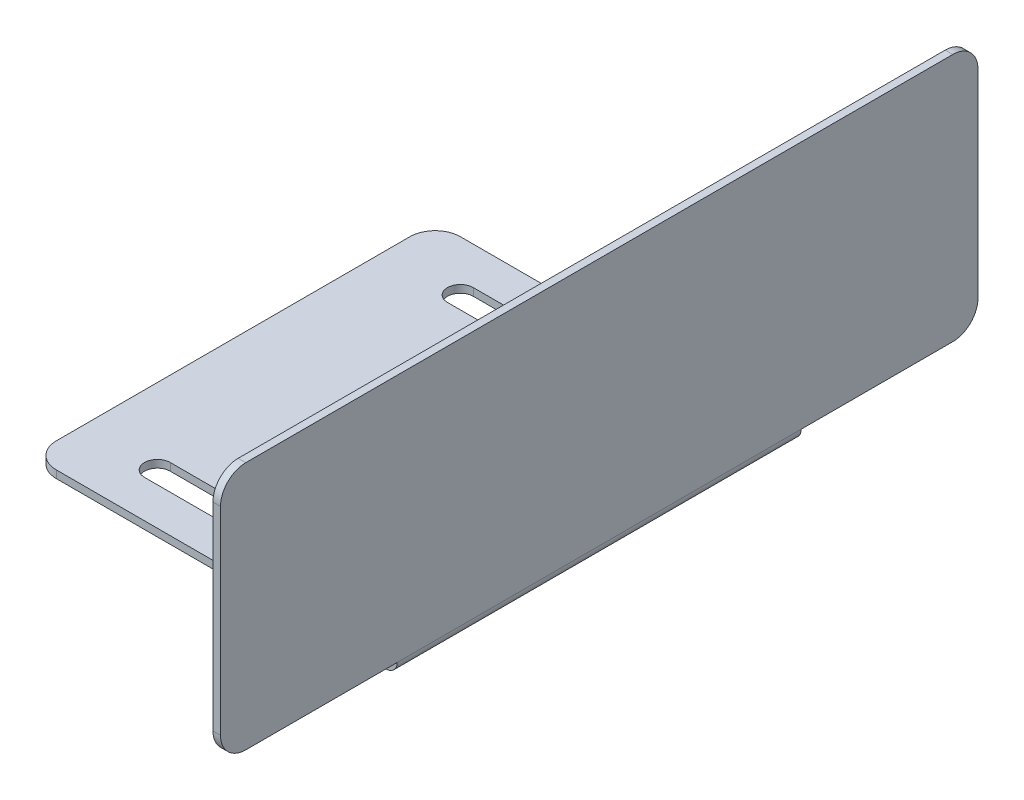
ISO-10303-21;
HEADER;
FILE_DESCRIPTION(('STEP AP214'),'2;1');
FILE_NAME('part.step','',(''),(''),'','','');
FILE_SCHEMA(('AUTOMOTIVE_DESIGN { 1 0 10303 214 1 1 1 1 }'));
ENDSEC;
DATA;
#1=APPLICATION_CONTEXT('core data for automotive mechanical design processes');
#2=APPLICATION_PROTOCOL_DEFINITION('international standard','automotive_design',2000,#1);
#3=PRODUCT_CONTEXT('',#1,'mechanical');
#4=PRODUCT('Part','Part','',(#3));
#5=PRODUCT_RELATED_PRODUCT_CATEGORY('part','',(#4));
#6=PRODUCT_DEFINITION_FORMATION('','',#4);
#7=PRODUCT_DEFINITION_CONTEXT('part definition',#1,'design');
#8=PRODUCT_DEFINITION('design','',#6,#7);
#9=PRODUCT_DEFINITION_SHAPE('','',#8);
#10=(LENGTH_UNIT() NAMED_UNIT(*) SI_UNIT(.MILLI.,.METRE.));
#11=(NAMED_UNIT(*) PLANE_ANGLE_UNIT() SI_UNIT($,.RADIAN.));
#12=(NAMED_UNIT(*) SI_UNIT($,.STERADIAN.) SOLID_ANGLE_UNIT());
#13=UNCERTAINTY_MEASURE_WITH_UNIT(LENGTH_MEASURE(1.E-05),#10,'distance_accuracy_value','');
#14=(GEOMETRIC_REPRESENTATION_CONTEXT(3) GLOBAL_UNCERTAINTY_ASSIGNED_CONTEXT((#13)) GLOBAL_UNIT_ASSIGNED_CONTEXT((#10,
#11,#12)) REPRESENTATION_CONTEXT('',''));
#15=CARTESIAN_POINT('',(0.,0.,0.));
#16=DIRECTION('',(0.,0.,1.));
#17=DIRECTION('',(1.,0.,0.));
#18=AXIS2_PLACEMENT_3D('',#15,#16,#17);
#19=CARTESIAN_POINT('',(37.,-26.5,35.));
#20=DIRECTION('',(0.,0.,1.));
#21=DIRECTION('',(1.,0.,0.));
#22=AXIS2_PLACEMENT_3D('',#19,#20,#21);
#23=PLANE('',#22);
#24=DIRECTION('',(-1.,0.,0.));
#25=VECTOR('',#24,1.);
#26=CARTESIAN_POINT('',(37.,-26.5,35.));
#27=LINE('',#26,#25);
#28=CARTESIAN_POINT('',(34.7634,-26.5,35.));
#29=VERTEX_POINT('',#28);
#30=CARTESIAN_POINT('',(-30.5,-26.5,35.));
#31=VERTEX_POINT('',#30);
#32=EDGE_CURVE('E214',#29,#31,#27,.T.);
#33=ORIENTED_EDGE('',*,*,#32,.T.);
#34=DIRECTION('',(0.,1.,0.));
#35=VECTOR('',#34,1.);
#36=CARTESIAN_POINT('',(-30.5,-25.,35.));
#37=LINE('',#36,#35);
#38=CARTESIAN_POINT('',(-30.5,-25.,35.));
#39=VERTEX_POINT('',#38);
#40=EDGE_CURVE('E287',#31,#39,#37,.T.);
#41=ORIENTED_EDGE('',*,*,#40,.T.);
#42=DIRECTION('',(1.,0.,0.));
#43=VECTOR('',#42,1.);
#44=CARTESIAN_POINT('',(-35.5,-25.,35.));
#45=LINE('',#44,#43);
#46=CARTESIAN_POINT('',(34.7634,-25.,35.));
#47=VERTEX_POINT('',#46);
#48=EDGE_CURVE('E480',#39,#47,#45,.T.);
#49=ORIENTED_EDGE('',*,*,#48,.T.);
#50=DIRECTION('',(0.,-1.,0.));
#51=VECTOR('',#50,1.);
#52=CARTESIAN_POINT('',(34.7634,-25.,35.));
#53=LINE('',#52,#51);
#54=EDGE_CURVE('E284',#47,#29,#53,.T.);
#55=ORIENTED_EDGE('',*,*,#54,.T.);
#56=EDGE_LOOP('',(#33,#41,#49,#55));
#57=FACE_BOUND('',#56,.T.);
#58=ADVANCED_FACE('F41',(#57),#23,.F.);
#59=CARTESIAN_POINT('',(37.,-26.5,115.));
#60=DIRECTION('',(0.,0.,-1.));
#61=DIRECTION('',(-1.,0.,0.));
#62=AXIS2_PLACEMENT_3D('',#59,#60,#61);
#63=PLANE('',#62);
#64=DIRECTION('',(-1.,0.,0.));
#65=VECTOR('',#64,1.);
#66=CARTESIAN_POINT('',(-35.5,-25.,115.));
#67=LINE('',#66,#65);
#68=CARTESIAN_POINT('',(34.7634,-25.,115.));
#69=VERTEX_POINT('',#68);
#70=CARTESIAN_POINT('',(-30.5,-25.,115.));
#71=VERTEX_POINT('',#70);
#72=EDGE_CURVE('E460',#69,#71,#67,.T.);
#73=ORIENTED_EDGE('',*,*,#72,.T.);
#74=DIRECTION('',(0.,-1.,0.));
#75=VECTOR('',#74,1.);
#76=CARTESIAN_POINT('',(-30.5,-26.5,115.));
#77=LINE('',#76,#75);
#78=CARTESIAN_POINT('',(-30.5,-26.5,115.));
#79=VERTEX_POINT('',#78);
#80=EDGE_CURVE('E309',#71,#79,#77,.T.);
#81=ORIENTED_EDGE('',*,*,#80,.T.);
#82=DIRECTION('',(-1.,0.,0.));
#83=VECTOR('',#82,1.);
#84=CARTESIAN_POINT('',(37.,-26.5,115.));
#85=LINE('',#84,#83);
#86=CARTESIAN_POINT('',(34.7634,-26.5,115.));
#87=VERTEX_POINT('',#86);
#88=EDGE_CURVE('E475',#87,#79,#85,.T.);
#89=ORIENTED_EDGE('',*,*,#88,.F.);
#90=DIRECTION('',(0.,1.,0.));
#91=VECTOR('',#90,1.);
#92=CARTESIAN_POINT('',(34.7634,-26.5,115.));
#93=LINE('',#92,#91);
#94=EDGE_CURVE('E234',#87,#69,#93,.T.);
#95=ORIENTED_EDGE('',*,*,#94,.T.);
#96=EDGE_LOOP('',(#73,#81,#89,#95));
#97=FACE_BOUND('',#96,.T.);
#98=ADVANCED_FACE('F516',(#97),#63,.F.);
#99=CARTESIAN_POINT('',(-35.5,-25.,150.));
#100=DIRECTION('',(0.,1.,0.));
#101=DIRECTION('',(0.,0.,1.));
#102=AXIS2_PLACEMENT_3D('',#99,#100,#101);
#103=PLANE('',#102);
#104=ORIENTED_EDGE('',*,*,#48,.F.);
#105=CARTESIAN_POINT('',(-30.5,-25.,40.));
#106=DIRECTION('',(0.,1.,0.));
#107=DIRECTION('',(0.,0.,1.));
#108=AXIS2_PLACEMENT_3D('',#105,#106,#107);
#109=CIRCLE('',#108,5.);
#110=CARTESIAN_POINT('',(-35.5,-25.,40.));
#111=VERTEX_POINT('',#110);
#112=EDGE_CURVE('E294',#39,#111,#109,.T.);
#113=ORIENTED_EDGE('',*,*,#112,.T.);
#114=DIRECTION('',(0.,0.,-1.));
#115=VECTOR('',#114,1.);
#116=CARTESIAN_POINT('',(-35.5,-25.,150.));
#117=LINE('',#116,#115);
#118=CARTESIAN_POINT('',(-35.5,-25.,110.));
#119=VERTEX_POINT('',#118);
#120=EDGE_CURVE('E260',#119,#111,#117,.T.);
#121=ORIENTED_EDGE('',*,*,#120,.F.);
#122=CARTESIAN_POINT('',(-30.5,-25.,110.));
#123=DIRECTION('',(0.,1.,0.));
#124=DIRECTION('',(0.,0.,1.));
#125=AXIS2_PLACEMENT_3D('',#122,#123,#124);
#126=CIRCLE('',#125,5.);
#127=EDGE_CURVE('E291',#119,#71,#126,.T.);
#128=ORIENTED_EDGE('',*,*,#127,.T.);
#129=ORIENTED_EDGE('',*,*,#72,.F.);
#130=DIRECTION('',(0.,0.,-1.));
#131=VECTOR('',#130,1.);
#132=CARTESIAN_POINT('',(34.7634,-25.,150.));
#133=LINE('',#132,#131);
#134=EDGE_CURVE('E264',#69,#47,#133,.T.);
#135=ORIENTED_EDGE('',*,*,#134,.T.);
#136=EDGE_LOOP('',(#104,#113,#121,#128,#129,#135));
#137=FACE_BOUND('',#136,.T.);
#138=DIRECTION('',(1.,0.,0.));
#139=VECTOR('',#138,1.);
#140=CARTESIAN_POINT('',(0.,-25.,47.5500000000001));
#141=LINE('',#140,#139);
#142=CARTESIAN_POINT('',(-20.4999999999999,-25.,47.5500000000001));
#143=VERTEX_POINT('',#142);
#144=CARTESIAN_POINT('',(-5.49999999999992,-25.,47.5500000000001));
#145=VERTEX_POINT('',#144);
#146=EDGE_CURVE('E406',#143,#145,#141,.T.);
#147=ORIENTED_EDGE('',*,*,#146,.F.);
#148=CARTESIAN_POINT('',(-20.4999999999996,-25.,45.));
#149=DIRECTION('',(0.,1.,0.));
#150=DIRECTION('',(0.,0.,1.));
#151=AXIS2_PLACEMENT_3D('',#148,#149,#150);
#152=CIRCLE('',#151,2.54999999999998);
#153=CARTESIAN_POINT('',(-20.5,-25.,42.4500000000001));
#154=VERTEX_POINT('',#153);
#155=EDGE_CURVE('E410',#143,#154,#152,.F.);
#156=ORIENTED_EDGE('',*,*,#155,.T.);
#157=DIRECTION('',(1.,0.,0.));
#158=VECTOR('',#157,1.);
#159=CARTESIAN_POINT('',(0.,-25.,42.4500000000001));
#160=LINE('',#159,#158);
#161=CARTESIAN_POINT('',(-5.49999999999985,-25.,42.4500000000001));
#162=VERTEX_POINT('',#161);
#163=EDGE_CURVE('E397',#154,#162,#160,.T.);
#164=ORIENTED_EDGE('',*,*,#163,.T.);
#165=CARTESIAN_POINT('',(-5.50000000000026,-25.,45.));
#166=DIRECTION('',(0.,1.,0.));
#167=DIRECTION('',(0.,0.,1.));
#168=AXIS2_PLACEMENT_3D('',#165,#166,#167);
#169=CIRCLE('',#168,2.54999999999998);
#170=EDGE_CURVE('E402',#145,#162,#169,.T.);
#171=ORIENTED_EDGE('',*,*,#170,.F.);
#172=EDGE_LOOP('',(#147,#156,#164,#171));
#173=FACE_BOUND('',#172,.T.);
#174=DIRECTION('',(1.,0.,0.));
#175=VECTOR('',#174,1.);
#176=CARTESIAN_POINT('',(0.,-25.,102.45));
#177=LINE('',#176,#175);
#178=CARTESIAN_POINT('',(-20.4999999999999,-25.,102.45));
#179=VERTEX_POINT('',#178);
#180=CARTESIAN_POINT('',(-5.49999999999992,-25.,102.45));
#181=VERTEX_POINT('',#180);
#182=EDGE_CURVE('E445',#179,#181,#177,.T.);
#183=ORIENTED_EDGE('',*,*,#182,.T.);
#184=CARTESIAN_POINT('',(-5.49999999999992,-25.,105.));
#185=DIRECTION('',(0.,1.,0.));
#186=DIRECTION('',(0.,0.,1.));
#187=AXIS2_PLACEMENT_3D('',#184,#185,#186);
#188=CIRCLE('',#187,2.54999999999998);
#189=CARTESIAN_POINT('',(-5.49999999999985,-25.,107.55));
#190=VERTEX_POINT('',#189);
#191=EDGE_CURVE('E414',#181,#190,#188,.F.);
#192=ORIENTED_EDGE('',*,*,#191,.T.);
#193=DIRECTION('',(1.,0.,0.));
#194=VECTOR('',#193,1.);
#195=CARTESIAN_POINT('',(0.,-25.,107.55));
#196=LINE('',#195,#194);
#197=CARTESIAN_POINT('',(-20.5,-25.,107.55));
#198=VERTEX_POINT('',#197);
#199=EDGE_CURVE('E429',#198,#190,#196,.T.);
#200=ORIENTED_EDGE('',*,*,#199,.F.);
#201=CARTESIAN_POINT('',(-20.5,-25.,105.));
#202=DIRECTION('',(0.,1.,0.));
#203=DIRECTION('',(0.,0.,1.));
#204=AXIS2_PLACEMENT_3D('',#201,#202,#203);
#205=CIRCLE('',#204,2.54999999999998);
#206=EDGE_CURVE('E449',#179,#198,#205,.T.);
#207=ORIENTED_EDGE('',*,*,#206,.F.);
#208=EDGE_LOOP('',(#183,#192,#200,#207));
#209=FACE_BOUND('',#208,.T.);
#210=ADVANCED_FACE('F503',(#137,#173,#209),#103,.T.);
#211=CARTESIAN_POINT('',(-35.5,-26.5,150.));
#212=DIRECTION('',(0.,1.,0.));
#213=DIRECTION('',(0.,0.,1.));
#214=AXIS2_PLACEMENT_3D('',#211,#212,#213);
#215=PLANE('',#214);
#216=CARTESIAN_POINT('',(-20.4999999999996,-26.5,45.));
#217=DIRECTION('',(0.,1.,0.));
#218=DIRECTION('',(0.,0.,1.));
#219=AXIS2_PLACEMENT_3D('',#216,#217,#218);
#220=CIRCLE('',#219,2.54999999999998);
#221=CARTESIAN_POINT('',(-20.4999999999999,-26.5,47.5500000000001));
#222=VERTEX_POINT('',#221);
#223=CARTESIAN_POINT('',(-20.5,-26.5,42.4500000000001));
#224=VERTEX_POINT('',#223);
#225=EDGE_CURVE('E401',#222,#224,#220,.F.);
#226=ORIENTED_EDGE('',*,*,#225,.F.);
#227=DIRECTION('',(1.,0.,0.));
#228=VECTOR('',#227,1.);
#229=CARTESIAN_POINT('',(0.,-26.5,47.5500000000001));
#230=LINE('',#229,#228);
#231=CARTESIAN_POINT('',(-5.49999999999992,-26.5,47.5500000000001));
#232=VERTEX_POINT('',#231);
#233=EDGE_CURVE('E420',#222,#232,#230,.T.);
#234=ORIENTED_EDGE('',*,*,#233,.T.);
#235=CARTESIAN_POINT('',(-5.50000000000026,-26.5,45.));
#236=DIRECTION('',(0.,1.,0.));
#237=DIRECTION('',(0.,0.,1.));
#238=AXIS2_PLACEMENT_3D('',#235,#236,#237);
#239=CIRCLE('',#238,2.54999999999998);
#240=CARTESIAN_POINT('',(-5.49999999999985,-26.5,42.4500000000001));
#241=VERTEX_POINT('',#240);
#242=EDGE_CURVE('E416',#232,#241,#239,.T.);
#243=ORIENTED_EDGE('',*,*,#242,.T.);
#244=DIRECTION('',(1.,0.,0.));
#245=VECTOR('',#244,1.);
#246=CARTESIAN_POINT('',(0.,-26.5,42.4500000000001));
#247=LINE('',#246,#245);
#248=EDGE_CURVE('E392',#224,#241,#247,.T.);
#249=ORIENTED_EDGE('',*,*,#248,.F.);
#250=EDGE_LOOP('',(#226,#234,#243,#249));
#251=FACE_BOUND('',#250,.T.);
#252=DIRECTION('',(0.,0.,-1.));
#253=VECTOR('',#252,1.);
#254=CARTESIAN_POINT('',(-35.5,-26.5,150.));
#255=LINE('',#254,#253);
#256=CARTESIAN_POINT('',(-35.5,-26.5,110.));
#257=VERTEX_POINT('',#256);
#258=CARTESIAN_POINT('',(-35.5,-26.5,40.));
#259=VERTEX_POINT('',#258);
#260=EDGE_CURVE('E256',#257,#259,#255,.T.);
#261=ORIENTED_EDGE('',*,*,#260,.T.);
#262=CARTESIAN_POINT('',(-30.5,-26.5,40.));
#263=DIRECTION('',(0.,1.,0.));
#264=DIRECTION('',(0.,0.,1.));
#265=AXIS2_PLACEMENT_3D('',#262,#263,#264);
#266=CIRCLE('',#265,5.);
#267=EDGE_CURVE('E306',#259,#31,#266,.F.);
#268=ORIENTED_EDGE('',*,*,#267,.T.);
#269=ORIENTED_EDGE('',*,*,#32,.F.);
#270=DIRECTION('',(0.,0.,-1.));
#271=VECTOR('',#270,1.);
#272=CARTESIAN_POINT('',(34.7634,-26.5,150.));
#273=LINE('',#272,#271);
#274=EDGE_CURVE('E232',#87,#29,#273,.T.);
#275=ORIENTED_EDGE('',*,*,#274,.F.);
#276=ORIENTED_EDGE('',*,*,#88,.T.);
#277=CARTESIAN_POINT('',(-30.5,-26.5,110.));
#278=DIRECTION('',(0.,1.,0.));
#279=DIRECTION('',(0.,0.,1.));
#280=AXIS2_PLACEMENT_3D('',#277,#278,#279);
#281=CIRCLE('',#280,5.);
#282=EDGE_CURVE('E303',#79,#257,#281,.F.);
#283=ORIENTED_EDGE('',*,*,#282,.T.);
#284=EDGE_LOOP('',(#261,#268,#269,#275,#276,#283));
#285=FACE_BOUND('',#284,.T.);
#286=CARTESIAN_POINT('',(-5.49999999999992,-26.5,105.));
#287=DIRECTION('',(0.,1.,0.));
#288=DIRECTION('',(0.,0.,1.));
#289=AXIS2_PLACEMENT_3D('',#286,#287,#288);
#290=CIRCLE('',#289,2.54999999999998);
#291=CARTESIAN_POINT('',(-5.49999999999992,-26.5,102.45));
#292=VERTEX_POINT('',#291);
#293=CARTESIAN_POINT('',(-5.49999999999985,-26.5,107.55));
#294=VERTEX_POINT('',#293);
#295=EDGE_CURVE('E426',#292,#294,#290,.F.);
#296=ORIENTED_EDGE('',*,*,#295,.F.);
#297=DIRECTION('',(1.,0.,0.));
#298=VECTOR('',#297,1.);
#299=CARTESIAN_POINT('',(0.,-26.5,102.45));
#300=LINE('',#299,#298);
#301=CARTESIAN_POINT('',(-20.4999999999999,-26.5,102.45));
#302=VERTEX_POINT('',#301);
#303=EDGE_CURVE('E430',#302,#292,#300,.T.);
#304=ORIENTED_EDGE('',*,*,#303,.F.);
#305=CARTESIAN_POINT('',(-20.5,-26.5,105.));
#306=DIRECTION('',(0.,1.,0.));
#307=DIRECTION('',(0.,0.,1.));
#308=AXIS2_PLACEMENT_3D('',#305,#306,#307);
#309=CIRCLE('',#308,2.54999999999998);
#310=CARTESIAN_POINT('',(-20.5,-26.5,107.55));
#311=VERTEX_POINT('',#310);
#312=EDGE_CURVE('E433',#302,#311,#309,.T.);
#313=ORIENTED_EDGE('',*,*,#312,.T.);
#314=DIRECTION('',(1.,0.,0.));
#315=VECTOR('',#314,1.);
#316=CARTESIAN_POINT('',(0.,-26.5,107.55));
#317=LINE('',#316,#315);
#318=EDGE_CURVE('E437',#311,#294,#317,.T.);
#319=ORIENTED_EDGE('',*,*,#318,.T.);
#320=EDGE_LOOP('',(#296,#304,#313,#319));
#321=FACE_BOUND('',#320,.T.);
#322=ADVANCED_FACE('F596',(#251,#285,#321),#215,.F.);
#323=CARTESIAN_POINT('',(34.7634,-26.5,150.));
#324=DIRECTION('',(0.,0.,1.));
#325=DIRECTION('',(1.,0.,0.));
#326=AXIS2_PLACEMENT_3D('',#323,#324,#325);
#327=PLANE('',#326);
#328=DIRECTION('',(0.,1.,0.));
#329=VECTOR('',#328,1.);
#330=CARTESIAN_POINT('',(35.5,-25.,150.));
#331=LINE('',#330,#329);
#332=CARTESIAN_POINT('',(35.5,-19.2634,150.));
#333=VERTEX_POINT('',#332);
#334=CARTESIAN_POINT('',(35.5,20.,150.));
#335=VERTEX_POINT('',#334);
#336=EDGE_CURVE('E241',#333,#335,#331,.T.);
#337=ORIENTED_EDGE('',*,*,#336,.F.);
#338=DIRECTION('',(1.,0.,0.));
#339=VECTOR('',#338,1.);
#340=CARTESIAN_POINT('',(37.,-19.2634,150.));
#341=LINE('',#340,#339);
#342=CARTESIAN_POINT('',(37.,-19.2634,150.));
#343=VERTEX_POINT('',#342);
#344=EDGE_CURVE('E346',#333,#343,#341,.T.);
#345=ORIENTED_EDGE('',*,*,#344,.T.);
#346=DIRECTION('',(0.,1.,0.));
#347=VECTOR('',#346,1.);
#348=CARTESIAN_POINT('',(37.,-25.,150.));
#349=LINE('',#348,#347);
#350=CARTESIAN_POINT('',(37.,20.,150.));
#351=VERTEX_POINT('',#350);
#352=EDGE_CURVE('E248',#343,#351,#349,.T.);
#353=ORIENTED_EDGE('',*,*,#352,.T.);
#354=DIRECTION('',(1.,0.,0.));
#355=VECTOR('',#354,1.);
#356=CARTESIAN_POINT('',(34.7634,20.,150.));
#357=LINE('',#356,#355);
#358=EDGE_CURVE('E343',#351,#335,#357,.F.);
#359=ORIENTED_EDGE('',*,*,#358,.T.);
#360=EDGE_LOOP('',(#337,#345,#353,#359));
#361=FACE_BOUND('',#360,.T.);
#362=ADVANCED_FACE('F599',(#361),#327,.T.);
#363=CARTESIAN_POINT('',(37.,-25.,150.));
#364=DIRECTION('',(-1.,0.,0.));
#365=DIRECTION('',(0.,0.,1.));
#366=AXIS2_PLACEMENT_3D('',#363,#364,#365);
#367=PLANE('',#366);
#368=DIRECTION('',(0.,0.,-1.));
#369=VECTOR('',#368,1.);
#370=CARTESIAN_POINT('',(37.,-24.2634,35.));
#371=LINE('',#370,#369);
#372=CARTESIAN_POINT('',(37.,-24.2634,35.));
#373=VERTEX_POINT('',#372);
#374=CARTESIAN_POINT('',(37.,-24.2634,5.));
#375=VERTEX_POINT('',#374);
#376=EDGE_CURVE('E215',#373,#375,#371,.T.);
#377=ORIENTED_EDGE('',*,*,#376,.T.);
#378=CARTESIAN_POINT('',(37.,-19.2634,5.));
#379=DIRECTION('',(-1.,0.,0.));
#380=DIRECTION('',(0.,0.,1.));
#381=AXIS2_PLACEMENT_3D('',#378,#379,#380);
#382=CIRCLE('',#381,5.);
#383=CARTESIAN_POINT('',(37.,-19.2634,0.));
#384=VERTEX_POINT('',#383);
#385=EDGE_CURVE('E340',#375,#384,#382,.F.);
#386=ORIENTED_EDGE('',*,*,#385,.T.);
#387=DIRECTION('',(0.,1.,0.));
#388=VECTOR('',#387,1.);
#389=CARTESIAN_POINT('',(37.,-25.,0.));
#390=LINE('',#389,#388);
#391=CARTESIAN_POINT('',(37.,20.,0.));
#392=VERTEX_POINT('',#391);
#393=EDGE_CURVE('E364',#384,#392,#390,.T.);
#394=ORIENTED_EDGE('',*,*,#393,.T.);
#395=CARTESIAN_POINT('',(37.,20.,5.));
#396=DIRECTION('',(-1.,0.,0.));
#397=DIRECTION('',(0.,0.,1.));
#398=AXIS2_PLACEMENT_3D('',#395,#396,#397);
#399=CIRCLE('',#398,5.);
#400=CARTESIAN_POINT('',(37.,25.,5.));
#401=VERTEX_POINT('',#400);
#402=EDGE_CURVE('E336',#392,#401,#399,.F.);
#403=ORIENTED_EDGE('',*,*,#402,.T.);
#404=DIRECTION('',(0.,0.,-1.));
#405=VECTOR('',#404,1.);
#406=CARTESIAN_POINT('',(37.,25.,150.));
#407=LINE('',#406,#405);
#408=CARTESIAN_POINT('',(37.,25.,145.));
#409=VERTEX_POINT('',#408);
#410=EDGE_CURVE('E276',#409,#401,#407,.T.);
#411=ORIENTED_EDGE('',*,*,#410,.F.);
#412=CARTESIAN_POINT('',(37.,20.,145.));
#413=DIRECTION('',(-1.,0.,0.));
#414=DIRECTION('',(0.,0.,1.));
#415=AXIS2_PLACEMENT_3D('',#412,#413,#414);
#416=CIRCLE('',#415,5.);
#417=EDGE_CURVE('E63',#409,#351,#416,.F.);
#418=ORIENTED_EDGE('',*,*,#417,.T.);
#419=ORIENTED_EDGE('',*,*,#352,.F.);
#420=CARTESIAN_POINT('',(37.,-19.2634,145.));
#421=DIRECTION('',(-1.,0.,0.));
#422=DIRECTION('',(0.,0.,1.));
#423=AXIS2_PLACEMENT_3D('',#420,#421,#422);
#424=CIRCLE('',#423,5.);
#425=CARTESIAN_POINT('',(37.,-24.2634,145.));
#426=VERTEX_POINT('',#425);
#427=EDGE_CURVE('E57',#343,#426,#424,.F.);
#428=ORIENTED_EDGE('',*,*,#427,.T.);
#429=DIRECTION('',(0.,0.,-1.));
#430=VECTOR('',#429,1.);
#431=CARTESIAN_POINT('',(37.,-24.2634,150.));
#432=LINE('',#431,#430);
#433=CARTESIAN_POINT('',(37.,-24.2634,115.));
#434=VERTEX_POINT('',#433);
#435=EDGE_CURVE('E238',#426,#434,#432,.T.);
#436=ORIENTED_EDGE('',*,*,#435,.T.);
#437=EDGE_CURVE('E230',#434,#373,#432,.T.);
#438=ORIENTED_EDGE('',*,*,#437,.T.);
#439=EDGE_LOOP('',(#377,#386,#394,#403,#411,#418,#419,#428,#436,#438));
#440=FACE_BOUND('',#439,.T.);
#441=ADVANCED_FACE('F237',(#440),#367,.F.);
#442=CARTESIAN_POINT('',(35.5,25.,150.));
#443=DIRECTION('',(0.,1.,0.));
#444=DIRECTION('',(0.,0.,1.));
#445=AXIS2_PLACEMENT_3D('',#442,#443,#444);
#446=PLANE('',#445);
#447=ORIENTED_EDGE('',*,*,#410,.T.);
#448=DIRECTION('',(1.,0.,0.));
#449=VECTOR('',#448,1.);
#450=CARTESIAN_POINT('',(35.5,25.,5.));
#451=LINE('',#450,#449);
#452=CARTESIAN_POINT('',(35.5,25.,5.));
#453=VERTEX_POINT('',#452);
#454=EDGE_CURVE('E12',#401,#453,#451,.F.);
#455=ORIENTED_EDGE('',*,*,#454,.T.);
#456=DIRECTION('',(0.,0.,-1.));
#457=VECTOR('',#456,1.);
#458=CARTESIAN_POINT('',(35.5,25.,150.));
#459=LINE('',#458,#457);
#460=CARTESIAN_POINT('',(35.5,25.,145.));
#461=VERTEX_POINT('',#460);
#462=EDGE_CURVE('E272',#461,#453,#459,.T.);
#463=ORIENTED_EDGE('',*,*,#462,.F.);
#464=DIRECTION('',(1.,0.,0.));
#465=VECTOR('',#464,1.);
#466=CARTESIAN_POINT('',(35.5,25.,145.));
#467=LINE('',#466,#465);
#468=EDGE_CURVE('E50',#461,#409,#467,.T.);
#469=ORIENTED_EDGE('',*,*,#468,.T.);
#470=EDGE_LOOP('',(#447,#455,#463,#469));
#471=FACE_BOUND('',#470,.T.);
#472=ADVANCED_FACE('F358',(#471),#446,.T.);
#473=CARTESIAN_POINT('',(35.5,-25.,150.));
#474=DIRECTION('',(-1.,0.,0.));
#475=DIRECTION('',(0.,0.,1.));
#476=AXIS2_PLACEMENT_3D('',#473,#474,#475);
#477=PLANE('',#476);
#478=DIRECTION('',(0.,1.,0.));
#479=VECTOR('',#478,1.);
#480=CARTESIAN_POINT('',(35.5,-25.,0.));
#481=LINE('',#480,#479);
#482=CARTESIAN_POINT('',(35.5,-19.2634,0.));
#483=VERTEX_POINT('',#482);
#484=CARTESIAN_POINT('',(35.5,20.,0.));
#485=VERTEX_POINT('',#484);
#486=EDGE_CURVE('E252',#483,#485,#481,.T.);
#487=ORIENTED_EDGE('',*,*,#486,.F.);
#488=CARTESIAN_POINT('',(35.5,-19.2634,5.));
#489=DIRECTION('',(-1.,0.,0.));
#490=DIRECTION('',(0.,0.,1.));
#491=AXIS2_PLACEMENT_3D('',#488,#489,#490);
#492=CIRCLE('',#491,5.);
#493=CARTESIAN_POINT('',(35.5,-24.2634,5.));
#494=VERTEX_POINT('',#493);
#495=EDGE_CURVE('E330',#483,#494,#492,.T.);
#496=ORIENTED_EDGE('',*,*,#495,.T.);
#497=DIRECTION('',(0.,0.,-1.));
#498=VECTOR('',#497,1.);
#499=CARTESIAN_POINT('',(35.5,-24.2634,150.));
#500=LINE('',#499,#498);
#501=CARTESIAN_POINT('',(35.5,-24.2634,35.));
#502=VERTEX_POINT('',#501);
#503=EDGE_CURVE('E488',#502,#494,#500,.T.);
#504=ORIENTED_EDGE('',*,*,#503,.F.);
#505=DIRECTION('',(0.,0.,-1.));
#506=VECTOR('',#505,1.);
#507=CARTESIAN_POINT('',(35.5,-24.2634,150.));
#508=LINE('',#507,#506);
#509=CARTESIAN_POINT('',(35.5,-24.2634,115.));
#510=VERTEX_POINT('',#509);
#511=EDGE_CURVE('E268',#510,#502,#508,.T.);
#512=ORIENTED_EDGE('',*,*,#511,.F.);
#513=CARTESIAN_POINT('',(35.5,-24.2634,145.));
#514=VERTEX_POINT('',#513);
#515=EDGE_CURVE('E269',#514,#510,#508,.T.);
#516=ORIENTED_EDGE('',*,*,#515,.F.);
#517=CARTESIAN_POINT('',(35.5,-19.2634,145.));
#518=DIRECTION('',(-1.,0.,0.));
#519=DIRECTION('',(0.,0.,1.));
#520=AXIS2_PLACEMENT_3D('',#517,#518,#519);
#521=CIRCLE('',#520,5.);
#522=EDGE_CURVE('E327',#514,#333,#521,.T.);
#523=ORIENTED_EDGE('',*,*,#522,.T.);
#524=ORIENTED_EDGE('',*,*,#336,.T.);
#525=CARTESIAN_POINT('',(35.5,20.,145.));
#526=DIRECTION('',(-1.,0.,0.));
#527=DIRECTION('',(0.,0.,1.));
#528=AXIS2_PLACEMENT_3D('',#525,#526,#527);
#529=CIRCLE('',#528,5.);
#530=EDGE_CURVE('E321',#335,#461,#529,.T.);
#531=ORIENTED_EDGE('',*,*,#530,.T.);
#532=ORIENTED_EDGE('',*,*,#462,.T.);
#533=CARTESIAN_POINT('',(35.5,20.,5.));
#534=DIRECTION('',(-1.,0.,0.));
#535=DIRECTION('',(0.,0.,1.));
#536=AXIS2_PLACEMENT_3D('',#533,#534,#535);
#537=CIRCLE('',#536,5.);
#538=EDGE_CURVE('E324',#453,#485,#537,.T.);
#539=ORIENTED_EDGE('',*,*,#538,.T.);
#540=EDGE_LOOP('',(#487,#496,#504,#512,#516,#523,#524,#531,#532,#539));
#541=FACE_BOUND('',#540,.T.);
#542=ADVANCED_FACE('F527',(#541),#477,.T.);
#543=CARTESIAN_POINT('',(34.7634,-24.2634,150.));
#544=DIRECTION('',(0.,0.,-1.));
#545=DIRECTION('',(-1.,0.,0.));
#546=AXIS2_PLACEMENT_3D('',#543,#544,#545);
#547=CYLINDRICAL_SURFACE('',#546,0.7366);
#548=CARTESIAN_POINT('',(34.7634,-24.2634,35.));
#549=DIRECTION('',(0.,0.,1.));
#550=DIRECTION('',(1.,0.,0.));
#551=AXIS2_PLACEMENT_3D('',#548,#549,#550);
#552=CIRCLE('',#551,0.7366);
#553=EDGE_CURVE('E209',#47,#502,#552,.T.);
#554=ORIENTED_EDGE('',*,*,#553,.F.);
#555=ORIENTED_EDGE('',*,*,#134,.F.);
#556=CARTESIAN_POINT('',(34.7634,-24.2634,115.));
#557=DIRECTION('',(0.,0.,-1.));
#558=DIRECTION('',(-1.,0.,0.));
#559=AXIS2_PLACEMENT_3D('',#556,#557,#558);
#560=CIRCLE('',#559,0.7366);
#561=EDGE_CURVE('E471',#510,#69,#560,.T.);
#562=ORIENTED_EDGE('',*,*,#561,.F.);
#563=ORIENTED_EDGE('',*,*,#511,.T.);
#564=EDGE_LOOP('',(#554,#555,#562,#563));
#565=FACE_BOUND('',#564,.T.);
#566=ADVANCED_FACE('F525',(#565),#547,.F.);
#567=CARTESIAN_POINT('',(-35.5,-26.5,150.));
#568=DIRECTION('',(-1.,0.,0.));
#569=DIRECTION('',(0.,0.,1.));
#570=AXIS2_PLACEMENT_3D('',#567,#568,#569);
#571=PLANE('',#570);
#572=ORIENTED_EDGE('',*,*,#120,.T.);
#573=DIRECTION('',(0.,1.,0.));
#574=VECTOR('',#573,1.);
#575=CARTESIAN_POINT('',(-35.5,-26.5,40.));
#576=LINE('',#575,#574);
#577=EDGE_CURVE('E300',#111,#259,#576,.F.);
#578=ORIENTED_EDGE('',*,*,#577,.T.);
#579=ORIENTED_EDGE('',*,*,#260,.F.);
#580=DIRECTION('',(0.,-1.,0.));
#581=VECTOR('',#580,1.);
#582=CARTESIAN_POINT('',(-35.5,-25.,110.));
#583=LINE('',#582,#581);
#584=EDGE_CURVE('E297',#257,#119,#583,.F.);
#585=ORIENTED_EDGE('',*,*,#584,.T.);
#586=EDGE_LOOP('',(#572,#578,#579,#585));
#587=FACE_BOUND('',#586,.T.);
#588=ADVANCED_FACE('F507',(#587),#571,.T.);
#589=CARTESIAN_POINT('',(34.7634,-24.2634,150.));
#590=DIRECTION('',(0.,0.,-1.));
#591=DIRECTION('',(-1.,0.,0.));
#592=AXIS2_PLACEMENT_3D('',#589,#590,#591);
#593=CYLINDRICAL_SURFACE('',#592,2.2366);
#594=ORIENTED_EDGE('',*,*,#274,.T.);
#595=CARTESIAN_POINT('',(34.7634,-24.2634,35.));
#596=DIRECTION('',(0.,0.,1.));
#597=DIRECTION('',(1.,0.,0.));
#598=AXIS2_PLACEMENT_3D('',#595,#596,#597);
#599=CIRCLE('',#598,2.2366);
#600=EDGE_CURVE('E206',#29,#373,#599,.T.);
#601=ORIENTED_EDGE('',*,*,#600,.T.);
#602=ORIENTED_EDGE('',*,*,#437,.F.);
#603=CARTESIAN_POINT('',(34.7634,-24.2634,115.));
#604=DIRECTION('',(0.,0.,-1.));
#605=DIRECTION('',(-1.,0.,0.));
#606=AXIS2_PLACEMENT_3D('',#603,#604,#605);
#607=CIRCLE('',#606,2.2366);
#608=EDGE_CURVE('E235',#434,#87,#607,.T.);
#609=ORIENTED_EDGE('',*,*,#608,.T.);
#610=EDGE_LOOP('',(#594,#601,#602,#609));
#611=FACE_BOUND('',#610,.T.);
#612=ADVANCED_FACE('F228',(#611),#593,.T.);
#613=CARTESIAN_POINT('',(34.7634,-24.2634,0.));
#614=DIRECTION('',(0.,0.,1.));
#615=DIRECTION('',(1.,0.,0.));
#616=AXIS2_PLACEMENT_3D('',#613,#614,#615);
#617=PLANE('',#616);
#618=ORIENTED_EDGE('',*,*,#393,.F.);
#619=DIRECTION('',(-1.,0.,0.));
#620=VECTOR('',#619,1.);
#621=CARTESIAN_POINT('',(34.7634,-19.2634,0.));
#622=LINE('',#621,#620);
#623=EDGE_CURVE('E317',#384,#483,#622,.T.);
#624=ORIENTED_EDGE('',*,*,#623,.T.);
#625=ORIENTED_EDGE('',*,*,#486,.T.);
#626=DIRECTION('',(1.,0.,0.));
#627=VECTOR('',#626,1.);
#628=CARTESIAN_POINT('',(37.,20.,0.));
#629=LINE('',#628,#627);
#630=EDGE_CURVE('E313',#485,#392,#629,.T.);
#631=ORIENTED_EDGE('',*,*,#630,.T.);
#632=EDGE_LOOP('',(#618,#624,#625,#631));
#633=FACE_BOUND('',#632,.T.);
#634=ADVANCED_FACE('F371',(#633),#617,.F.);
#635=CARTESIAN_POINT('',(-20.4999999999996,-26.5,45.));
#636=DIRECTION('',(0.,1.,0.));
#637=DIRECTION('',(0.,0.,1.));
#638=AXIS2_PLACEMENT_3D('',#635,#636,#637);
#639=CYLINDRICAL_SURFACE('',#638,2.54999999999998);
#640=ORIENTED_EDGE('',*,*,#155,.F.);
#641=DIRECTION('',(0.,1.,0.));
#642=VECTOR('',#641,1.);
#643=CARTESIAN_POINT('',(-20.4999999999999,-26.5,47.5500000000001));
#644=LINE('',#643,#642);
#645=EDGE_CURVE('E387',#222,#143,#644,.T.);
#646=ORIENTED_EDGE('',*,*,#645,.F.);
#647=ORIENTED_EDGE('',*,*,#225,.T.);
#648=DIRECTION('',(0.,1.,0.));
#649=VECTOR('',#648,1.);
#650=CARTESIAN_POINT('',(-20.5,-26.5,42.4500000000001));
#651=LINE('',#650,#649);
#652=EDGE_CURVE('E380',#224,#154,#651,.T.);
#653=ORIENTED_EDGE('',*,*,#652,.T.);
#654=EDGE_LOOP('',(#640,#646,#647,#653));
#655=FACE_BOUND('',#654,.T.);
#656=ADVANCED_FACE('F581',(#655),#639,.F.);
#657=CARTESIAN_POINT('',(0.,-26.5,42.4500000000001));
#658=DIRECTION('',(0.,0.,1.));
#659=DIRECTION('',(1.,0.,0.));
#660=AXIS2_PLACEMENT_3D('',#657,#658,#659);
#661=PLANE('',#660);
#662=ORIENTED_EDGE('',*,*,#163,.F.);
#663=ORIENTED_EDGE('',*,*,#652,.F.);
#664=ORIENTED_EDGE('',*,*,#248,.T.);
#665=DIRECTION('',(0.,1.,0.));
#666=VECTOR('',#665,1.);
#667=CARTESIAN_POINT('',(-5.49999999999985,-26.5,42.4500000000001));
#668=LINE('',#667,#666);
#669=EDGE_CURVE('E384',#241,#162,#668,.T.);
#670=ORIENTED_EDGE('',*,*,#669,.T.);
#671=EDGE_LOOP('',(#662,#663,#664,#670));
#672=FACE_BOUND('',#671,.T.);
#673=ADVANCED_FACE('F577',(#672),#661,.T.);
#674=CARTESIAN_POINT('',(-5.50000000000026,-26.5,45.));
#675=DIRECTION('',(0.,1.,0.));
#676=DIRECTION('',(0.,0.,1.));
#677=AXIS2_PLACEMENT_3D('',#674,#675,#676);
#678=CYLINDRICAL_SURFACE('',#677,2.54999999999998);
#679=ORIENTED_EDGE('',*,*,#170,.T.);
#680=ORIENTED_EDGE('',*,*,#669,.F.);
#681=ORIENTED_EDGE('',*,*,#242,.F.);
#682=DIRECTION('',(0.,1.,0.));
#683=VECTOR('',#682,1.);
#684=CARTESIAN_POINT('',(-5.49999999999992,-26.5,47.5500000000001));
#685=LINE('',#684,#683);
#686=EDGE_CURVE('E391',#232,#145,#685,.T.);
#687=ORIENTED_EDGE('',*,*,#686,.T.);
#688=EDGE_LOOP('',(#679,#680,#681,#687));
#689=FACE_BOUND('',#688,.T.);
#690=ADVANCED_FACE('F580',(#689),#678,.F.);
#691=CARTESIAN_POINT('',(0.,-26.5,47.5500000000001));
#692=DIRECTION('',(0.,0.,1.));
#693=DIRECTION('',(1.,0.,0.));
#694=AXIS2_PLACEMENT_3D('',#691,#692,#693);
#695=PLANE('',#694);
#696=ORIENTED_EDGE('',*,*,#146,.T.);
#697=ORIENTED_EDGE('',*,*,#686,.F.);
#698=ORIENTED_EDGE('',*,*,#233,.F.);
#699=ORIENTED_EDGE('',*,*,#645,.T.);
#700=EDGE_LOOP('',(#696,#697,#698,#699));
#701=FACE_BOUND('',#700,.T.);
#702=ADVANCED_FACE('F565',(#701),#695,.F.);
#703=CARTESIAN_POINT('',(-5.49999999999992,-26.5,105.));
#704=DIRECTION('',(0.,1.,0.));
#705=DIRECTION('',(0.,0.,1.));
#706=AXIS2_PLACEMENT_3D('',#703,#704,#705);
#707=CYLINDRICAL_SURFACE('',#706,2.54999999999998);
#708=ORIENTED_EDGE('',*,*,#191,.F.);
#709=DIRECTION('',(0.,1.,0.));
#710=VECTOR('',#709,1.);
#711=CARTESIAN_POINT('',(-5.49999999999992,-26.5,102.45));
#712=LINE('',#711,#710);
#713=EDGE_CURVE('E441',#292,#181,#712,.T.);
#714=ORIENTED_EDGE('',*,*,#713,.F.);
#715=ORIENTED_EDGE('',*,*,#295,.T.);
#716=DIRECTION('',(0.,1.,0.));
#717=VECTOR('',#716,1.);
#718=CARTESIAN_POINT('',(-5.49999999999985,-26.5,107.55));
#719=LINE('',#718,#717);
#720=EDGE_CURVE('E456',#294,#190,#719,.T.);
#721=ORIENTED_EDGE('',*,*,#720,.T.);
#722=EDGE_LOOP('',(#708,#714,#715,#721));
#723=FACE_BOUND('',#722,.T.);
#724=ADVANCED_FACE('F561',(#723),#707,.F.);
#725=CARTESIAN_POINT('',(0.,-26.5,107.55));
#726=DIRECTION('',(0.,0.,1.));
#727=DIRECTION('',(1.,0.,0.));
#728=AXIS2_PLACEMENT_3D('',#725,#726,#727);
#729=PLANE('',#728);
#730=ORIENTED_EDGE('',*,*,#199,.T.);
#731=ORIENTED_EDGE('',*,*,#720,.F.);
#732=ORIENTED_EDGE('',*,*,#318,.F.);
#733=DIRECTION('',(0.,1.,0.));
#734=VECTOR('',#733,1.);
#735=CARTESIAN_POINT('',(-20.5,-26.5,107.55));
#736=LINE('',#735,#734);
#737=EDGE_CURVE('E459',#311,#198,#736,.T.);
#738=ORIENTED_EDGE('',*,*,#737,.T.);
#739=EDGE_LOOP('',(#730,#731,#732,#738));
#740=FACE_BOUND('',#739,.T.);
#741=ADVANCED_FACE('F564',(#740),#729,.F.);
#742=CARTESIAN_POINT('',(-20.5,-26.5,105.));
#743=DIRECTION('',(0.,1.,0.));
#744=DIRECTION('',(0.,0.,1.));
#745=AXIS2_PLACEMENT_3D('',#742,#743,#744);
#746=CYLINDRICAL_SURFACE('',#745,2.54999999999998);
#747=ORIENTED_EDGE('',*,*,#206,.T.);
#748=ORIENTED_EDGE('',*,*,#737,.F.);
#749=ORIENTED_EDGE('',*,*,#312,.F.);
#750=DIRECTION('',(0.,1.,0.));
#751=VECTOR('',#750,1.);
#752=CARTESIAN_POINT('',(-20.4999999999999,-26.5,102.45));
#753=LINE('',#752,#751);
#754=EDGE_CURVE('E462',#302,#179,#753,.T.);
#755=ORIENTED_EDGE('',*,*,#754,.T.);
#756=EDGE_LOOP('',(#747,#748,#749,#755));
#757=FACE_BOUND('',#756,.T.);
#758=ADVANCED_FACE('F569',(#757),#746,.F.);
#759=CARTESIAN_POINT('',(0.,-26.5,102.45));
#760=DIRECTION('',(0.,0.,1.));
#761=DIRECTION('',(1.,0.,0.));
#762=AXIS2_PLACEMENT_3D('',#759,#760,#761);
#763=PLANE('',#762);
#764=ORIENTED_EDGE('',*,*,#182,.F.);
#765=ORIENTED_EDGE('',*,*,#754,.F.);
#766=ORIENTED_EDGE('',*,*,#303,.T.);
#767=ORIENTED_EDGE('',*,*,#713,.T.);
#768=EDGE_LOOP('',(#764,#765,#766,#767));
#769=FACE_BOUND('',#768,.T.);
#770=ADVANCED_FACE('F559',(#769),#763,.T.);
#771=ORIENTED_EDGE('',*,*,#94,.F.);
#772=ORIENTED_EDGE('',*,*,#608,.F.);
#773=DIRECTION('',(-1.,0.,0.));
#774=VECTOR('',#773,1.);
#775=CARTESIAN_POINT('',(37.,-24.2634,115.));
#776=LINE('',#775,#774);
#777=EDGE_CURVE('E476',#434,#510,#776,.T.);
#778=ORIENTED_EDGE('',*,*,#777,.T.);
#779=ORIENTED_EDGE('',*,*,#561,.T.);
#780=EDGE_LOOP('',(#771,#772,#778,#779));
#781=FACE_BOUND('',#780,.T.);
#782=ADVANCED_FACE('F521',(#781),#63,.F.);
#783=CARTESIAN_POINT('',(37.,-24.2634,115.));
#784=DIRECTION('',(0.,1.,0.));
#785=DIRECTION('',(0.,0.,1.));
#786=AXIS2_PLACEMENT_3D('',#783,#784,#785);
#787=PLANE('',#786);
#788=ORIENTED_EDGE('',*,*,#435,.F.);
#789=DIRECTION('',(1.,0.,0.));
#790=VECTOR('',#789,1.);
#791=CARTESIAN_POINT('',(35.5,-24.2634,145.));
#792=LINE('',#791,#790);
#793=EDGE_CURVE('E350',#426,#514,#792,.F.);
#794=ORIENTED_EDGE('',*,*,#793,.T.);
#795=ORIENTED_EDGE('',*,*,#515,.T.);
#796=ORIENTED_EDGE('',*,*,#777,.F.);
#797=EDGE_LOOP('',(#788,#794,#795,#796));
#798=FACE_BOUND('',#797,.T.);
#799=ADVANCED_FACE('F549',(#798),#787,.F.);
#800=ORIENTED_EDGE('',*,*,#54,.F.);
#801=ORIENTED_EDGE('',*,*,#553,.T.);
#802=DIRECTION('',(-1.,0.,0.));
#803=VECTOR('',#802,1.);
#804=CARTESIAN_POINT('',(37.,-24.2634,35.));
#805=LINE('',#804,#803);
#806=EDGE_CURVE('E201',#373,#502,#805,.T.);
#807=ORIENTED_EDGE('',*,*,#806,.F.);
#808=ORIENTED_EDGE('',*,*,#600,.F.);
#809=EDGE_LOOP('',(#800,#801,#807,#808));
#810=FACE_BOUND('',#809,.T.);
#811=ADVANCED_FACE('F204',(#810),#23,.F.);
#812=CARTESIAN_POINT('',(37.,-24.2634,35.));
#813=DIRECTION('',(0.,1.,0.));
#814=DIRECTION('',(0.,0.,1.));
#815=AXIS2_PLACEMENT_3D('',#812,#813,#814);
#816=PLANE('',#815);
#817=ORIENTED_EDGE('',*,*,#503,.T.);
#818=DIRECTION('',(-1.,0.,0.));
#819=VECTOR('',#818,1.);
#820=CARTESIAN_POINT('',(37.,-24.2634,5.));
#821=LINE('',#820,#819);
#822=EDGE_CURVE('E220',#494,#375,#821,.F.);
#823=ORIENTED_EDGE('',*,*,#822,.T.);
#824=ORIENTED_EDGE('',*,*,#376,.F.);
#825=ORIENTED_EDGE('',*,*,#806,.T.);
#826=EDGE_LOOP('',(#817,#823,#824,#825));
#827=FACE_BOUND('',#826,.T.);
#828=ADVANCED_FACE('F218',(#827),#816,.F.);
#829=CARTESIAN_POINT('',(-30.5,-26.5,40.));
#830=DIRECTION('',(0.,-1.,0.));
#831=DIRECTION('',(0.,0.,-1.));
#832=AXIS2_PLACEMENT_3D('',#829,#830,#831);
#833=CYLINDRICAL_SURFACE('',#832,5.);
#834=ORIENTED_EDGE('',*,*,#267,.F.);
#835=ORIENTED_EDGE('',*,*,#577,.F.);
#836=ORIENTED_EDGE('',*,*,#112,.F.);
#837=ORIENTED_EDGE('',*,*,#40,.F.);
#838=EDGE_LOOP('',(#834,#835,#836,#837));
#839=FACE_BOUND('',#838,.T.);
#840=ADVANCED_FACE('F499',(#839),#833,.T.);
#841=CARTESIAN_POINT('',(-30.5,-26.5,110.));
#842=DIRECTION('',(0.,1.,0.));
#843=DIRECTION('',(0.,0.,1.));
#844=AXIS2_PLACEMENT_3D('',#841,#842,#843);
#845=CYLINDRICAL_SURFACE('',#844,5.);
#846=ORIENTED_EDGE('',*,*,#127,.F.);
#847=ORIENTED_EDGE('',*,*,#584,.F.);
#848=ORIENTED_EDGE('',*,*,#282,.F.);
#849=ORIENTED_EDGE('',*,*,#80,.F.);
#850=EDGE_LOOP('',(#846,#847,#848,#849));
#851=FACE_BOUND('',#850,.T.);
#852=ADVANCED_FACE('F511',(#851),#845,.T.);
#853=CARTESIAN_POINT('',(34.7634,-19.2634,5.));
#854=DIRECTION('',(-1.,0.,0.));
#855=DIRECTION('',(0.,0.,1.));
#856=AXIS2_PLACEMENT_3D('',#853,#854,#855);
#857=CYLINDRICAL_SURFACE('',#856,5.);
#858=ORIENTED_EDGE('',*,*,#385,.F.);
#859=ORIENTED_EDGE('',*,*,#822,.F.);
#860=ORIENTED_EDGE('',*,*,#495,.F.);
#861=ORIENTED_EDGE('',*,*,#623,.F.);
#862=EDGE_LOOP('',(#858,#859,#860,#861));
#863=FACE_BOUND('',#862,.T.);
#864=ADVANCED_FACE('F530',(#863),#857,.T.);
#865=CARTESIAN_POINT('',(34.7634,-19.2634,145.));
#866=DIRECTION('',(-1.,0.,0.));
#867=DIRECTION('',(0.,0.,1.));
#868=AXIS2_PLACEMENT_3D('',#865,#866,#867);
#869=CYLINDRICAL_SURFACE('',#868,5.);
#870=ORIENTED_EDGE('',*,*,#522,.F.);
#871=ORIENTED_EDGE('',*,*,#793,.F.);
#872=ORIENTED_EDGE('',*,*,#427,.F.);
#873=ORIENTED_EDGE('',*,*,#344,.F.);
#874=EDGE_LOOP('',(#870,#871,#872,#873));
#875=FACE_BOUND('',#874,.T.);
#876=ADVANCED_FACE('F532',(#875),#869,.T.);
#877=CARTESIAN_POINT('',(34.7634,20.,5.));
#878=DIRECTION('',(-1.,0.,0.));
#879=DIRECTION('',(0.,0.,1.));
#880=AXIS2_PLACEMENT_3D('',#877,#878,#879);
#881=CYLINDRICAL_SURFACE('',#880,5.);
#882=ORIENTED_EDGE('',*,*,#538,.F.);
#883=ORIENTED_EDGE('',*,*,#454,.F.);
#884=ORIENTED_EDGE('',*,*,#402,.F.);
#885=ORIENTED_EDGE('',*,*,#630,.F.);
#886=EDGE_LOOP('',(#882,#883,#884,#885));
#887=FACE_BOUND('',#886,.T.);
#888=ADVANCED_FACE('F368',(#887),#881,.T.);
#889=CARTESIAN_POINT('',(35.5,20.,145.));
#890=DIRECTION('',(1.,0.,0.));
#891=DIRECTION('',(0.,0.,-1.));
#892=AXIS2_PLACEMENT_3D('',#889,#890,#891);
#893=CYLINDRICAL_SURFACE('',#892,5.);
#894=ORIENTED_EDGE('',*,*,#530,.F.);
#895=ORIENTED_EDGE('',*,*,#358,.F.);
#896=ORIENTED_EDGE('',*,*,#417,.F.);
#897=ORIENTED_EDGE('',*,*,#468,.F.);
#898=EDGE_LOOP('',(#894,#895,#896,#897));
#899=FACE_BOUND('',#898,.T.);
#900=ADVANCED_FACE('F43',(#899),#893,.T.);
#901=CLOSED_SHELL('',(#58,#98,#210,#322,#362,#441,#472,#542,#566,#588,#612,#634,#656,#673,#690,
#702,#724,#741,#758,#770,#782,#799,#811,#828,#840,#852,#864,#876,#888,#900));
#902=MANIFOLD_SOLID_BREP('B2',#901);
#903=ADVANCED_BREP_SHAPE_REPRESENTATION('',(#18,#902),#14);
#904=SHAPE_DEFINITION_REPRESENTATION(#9,#903);
ENDSEC;
END-ISO-10303-21;
